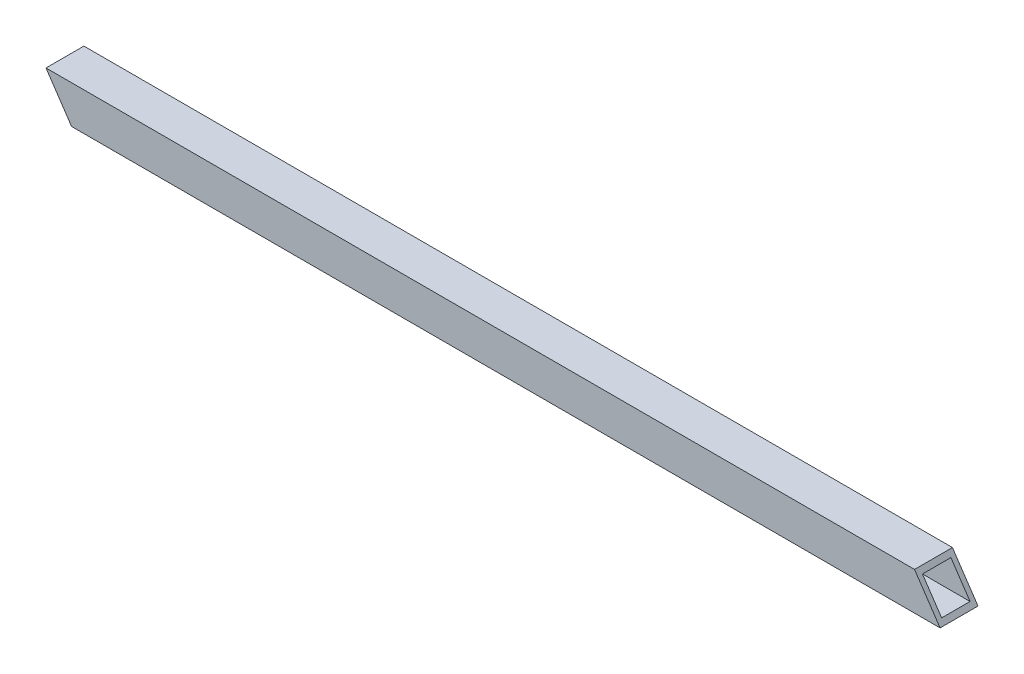
ISO-10303-21;
HEADER;
FILE_DESCRIPTION(('STEP AP214'),'2;1');
FILE_NAME('part.step','',(''),(''),'','','');
FILE_SCHEMA(('AUTOMOTIVE_DESIGN { 1 0 10303 214 1 1 1 1 }'));
ENDSEC;
DATA;
#1=APPLICATION_CONTEXT('core data for automotive mechanical design processes');
#2=APPLICATION_PROTOCOL_DEFINITION('international standard','automotive_design',2000,#1);
#3=PRODUCT_CONTEXT('',#1,'mechanical');
#4=PRODUCT('Part','Part','',(#3));
#5=PRODUCT_RELATED_PRODUCT_CATEGORY('part','',(#4));
#6=PRODUCT_DEFINITION_FORMATION('','',#4);
#7=PRODUCT_DEFINITION_CONTEXT('part definition',#1,'design');
#8=PRODUCT_DEFINITION('design','',#6,#7);
#9=PRODUCT_DEFINITION_SHAPE('','',#8);
#10=(LENGTH_UNIT() NAMED_UNIT(*) SI_UNIT(.MILLI.,.METRE.));
#11=(NAMED_UNIT(*) PLANE_ANGLE_UNIT() SI_UNIT($,.RADIAN.));
#12=(NAMED_UNIT(*) SI_UNIT($,.STERADIAN.) SOLID_ANGLE_UNIT());
#13=UNCERTAINTY_MEASURE_WITH_UNIT(LENGTH_MEASURE(1.E-05),#10,'distance_accuracy_value','');
#14=(GEOMETRIC_REPRESENTATION_CONTEXT(3) GLOBAL_UNCERTAINTY_ASSIGNED_CONTEXT((#13)) GLOBAL_UNIT_ASSIGNED_CONTEXT((#10,
#11,#12)) REPRESENTATION_CONTEXT('',''));
#15=CARTESIAN_POINT('',(0.,0.,0.));
#16=DIRECTION('',(0.,0.,1.));
#17=DIRECTION('',(1.,0.,0.));
#18=AXIS2_PLACEMENT_3D('',#15,#16,#17);
#19=CARTESIAN_POINT('',(1930.4,426.362283996303,-242.054722692657));
#20=DIRECTION('',(0.,0.,1.));
#21=DIRECTION('',(1.,0.,0.));
#22=AXIS2_PLACEMENT_3D('',#19,#20,#21);
#23=PLANE('',#22);
#24=DIRECTION('',(-1.,0.,0.));
#25=VECTOR('',#24,1.);
#26=CARTESIAN_POINT('',(1930.4,477.162283996303,-242.054722692657));
#27=LINE('',#26,#25);
#28=CARTESIAN_POINT('',(1164.24156389597,477.162283996303,-242.054722692657));
#29=VERTEX_POINT('',#28);
#30=CARTESIAN_POINT('',(0.,477.162283996303,-242.054722692657));
#31=VERTEX_POINT('',#30);
#32=EDGE_CURVE('E107',#29,#31,#27,.T.);
#33=ORIENTED_EDGE('',*,*,#32,.F.);
#34=DIRECTION('',(0.559192903470751,-0.829037572555039,0.));
#35=VECTOR('',#34,1.);
#36=CARTESIAN_POINT('',(1164.24156389597,477.162283996303,-242.054722692657));
#37=LINE('',#36,#35);
#38=CARTESIAN_POINT('',(1198.50659655157,426.362283996303,-242.054722692657));
#39=VERTEX_POINT('',#38);
#40=EDGE_CURVE('E94',#29,#39,#37,.T.);
#41=ORIENTED_EDGE('',*,*,#40,.T.);
#42=DIRECTION('',(-1.,0.,0.));
#43=VECTOR('',#42,1.);
#44=CARTESIAN_POINT('',(1930.4,426.362283996303,-242.054722692657));
#45=LINE('',#44,#43);
#46=CARTESIAN_POINT('',(34.2650326555957,426.362283996303,-242.054722692657));
#47=VERTEX_POINT('',#46);
#48=EDGE_CURVE('E121',#39,#47,#45,.T.);
#49=ORIENTED_EDGE('',*,*,#48,.T.);
#50=DIRECTION('',(-0.559192903470751,0.829037572555039,0.));
#51=VECTOR('',#50,1.);
#52=CARTESIAN_POINT('',(0.,477.162283996303,-242.054722692657));
#53=LINE('',#52,#51);
#54=EDGE_CURVE('E114',#47,#31,#53,.T.);
#55=ORIENTED_EDGE('',*,*,#54,.T.);
#56=EDGE_LOOP('',(#33,#41,#49,#55));
#57=FACE_BOUND('',#56,.T.);
#58=ADVANCED_FACE('F33',(#57),#23,.F.);
#59=CARTESIAN_POINT('',(1930.4,477.162283996303,-242.054722692657));
#60=DIRECTION('',(0.,-1.,0.));
#61=DIRECTION('',(0.,0.,-1.));
#62=AXIS2_PLACEMENT_3D('',#59,#60,#61);
#63=PLANE('',#62);
#64=DIRECTION('',(-1.,0.,0.));
#65=VECTOR('',#64,1.);
#66=CARTESIAN_POINT('',(1930.4,477.162283996303,-191.254722692657));
#67=LINE('',#66,#65);
#68=CARTESIAN_POINT('',(1164.24156389597,477.162283996303,-191.254722692657));
#69=VERTEX_POINT('',#68);
#70=CARTESIAN_POINT('',(0.,477.162283996303,-191.254722692657));
#71=VERTEX_POINT('',#70);
#72=EDGE_CURVE('E109',#69,#71,#67,.T.);
#73=ORIENTED_EDGE('',*,*,#72,.F.);
#74=DIRECTION('',(0.,0.,1.));
#75=VECTOR('',#74,1.);
#76=CARTESIAN_POINT('',(1164.24156389597,477.162283996303,-242.054722692657));
#77=LINE('',#76,#75);
#78=EDGE_CURVE('E97',#29,#69,#77,.T.);
#79=ORIENTED_EDGE('',*,*,#78,.F.);
#80=ORIENTED_EDGE('',*,*,#32,.T.);
#81=DIRECTION('',(0.,0.,1.));
#82=VECTOR('',#81,1.);
#83=CARTESIAN_POINT('',(0.,477.162283996303,-242.054722692657));
#84=LINE('',#83,#82);
#85=EDGE_CURVE('E123',#31,#71,#84,.T.);
#86=ORIENTED_EDGE('',*,*,#85,.T.);
#87=EDGE_LOOP('',(#73,#79,#80,#86));
#88=FACE_BOUND('',#87,.T.);
#89=ADVANCED_FACE('F105',(#88),#63,.F.);
#90=CARTESIAN_POINT('',(1930.4,426.362283996303,-191.254722692657));
#91=DIRECTION('',(0.,0.,1.));
#92=DIRECTION('',(1.,0.,0.));
#93=AXIS2_PLACEMENT_3D('',#90,#91,#92);
#94=PLANE('',#93);
#95=DIRECTION('',(0.559192903470751,-0.829037572555039,0.));
#96=VECTOR('',#95,1.);
#97=CARTESIAN_POINT('',(1164.24156389597,477.162283996303,-191.254722692657));
#98=LINE('',#97,#96);
#99=CARTESIAN_POINT('',(1198.50659655157,426.362283996303,-191.254722692657));
#100=VERTEX_POINT('',#99);
#101=EDGE_CURVE('E47',#69,#100,#98,.T.);
#102=ORIENTED_EDGE('',*,*,#101,.F.);
#103=ORIENTED_EDGE('',*,*,#72,.T.);
#104=DIRECTION('',(-0.559192903470751,0.829037572555039,0.));
#105=VECTOR('',#104,1.);
#106=CARTESIAN_POINT('',(0.,477.162283996303,-191.254722692657));
#107=LINE('',#106,#105);
#108=CARTESIAN_POINT('',(34.2650326555957,426.362283996303,-191.254722692657));
#109=VERTEX_POINT('',#108);
#110=EDGE_CURVE('E145',#109,#71,#107,.T.);
#111=ORIENTED_EDGE('',*,*,#110,.F.);
#112=DIRECTION('',(-1.,0.,0.));
#113=VECTOR('',#112,1.);
#114=CARTESIAN_POINT('',(1930.4,426.362283996303,-191.254722692657));
#115=LINE('',#114,#113);
#116=EDGE_CURVE('E117',#100,#109,#115,.T.);
#117=ORIENTED_EDGE('',*,*,#116,.F.);
#118=EDGE_LOOP('',(#102,#103,#111,#117));
#119=FACE_BOUND('',#118,.T.);
#120=ADVANCED_FACE('F185',(#119),#94,.T.);
#121=CARTESIAN_POINT('',(1930.4,426.362283996303,-242.054722692657));
#122=DIRECTION('',(0.,-1.,0.));
#123=DIRECTION('',(0.,0.,-1.));
#124=AXIS2_PLACEMENT_3D('',#121,#122,#123);
#125=PLANE('',#124);
#126=DIRECTION('',(0.,0.,-1.));
#127=VECTOR('',#126,1.);
#128=CARTESIAN_POINT('',(1198.50659655157,426.362283996303,-242.054722692657));
#129=LINE('',#128,#127);
#130=EDGE_CURVE('E98',#100,#39,#129,.T.);
#131=ORIENTED_EDGE('',*,*,#130,.F.);
#132=ORIENTED_EDGE('',*,*,#116,.T.);
#133=DIRECTION('',(0.,0.,1.));
#134=VECTOR('',#133,1.);
#135=CARTESIAN_POINT('',(34.2650326555957,426.362283996303,-242.054722692657));
#136=LINE('',#135,#134);
#137=EDGE_CURVE('E142',#47,#109,#136,.T.);
#138=ORIENTED_EDGE('',*,*,#137,.F.);
#139=ORIENTED_EDGE('',*,*,#48,.F.);
#140=EDGE_LOOP('',(#131,#132,#138,#139));
#141=FACE_BOUND('',#140,.T.);
#142=ADVANCED_FACE('F189',(#141),#125,.T.);
#143=CARTESIAN_POINT('',(1930.4,432.712283996303,-197.604722692657));
#144=DIRECTION('',(0.,0.,1.));
#145=DIRECTION('',(1.,0.,0.));
#146=AXIS2_PLACEMENT_3D('',#143,#144,#145);
#147=PLANE('',#146);
#148=DIRECTION('',(-1.,0.,0.));
#149=VECTOR('',#148,1.);
#150=CARTESIAN_POINT('',(1930.4,470.812283996303,-197.604722692657));
#151=LINE('',#150,#149);
#152=CARTESIAN_POINT('',(1168.52469297792,470.812283996303,-197.604722692657));
#153=VERTEX_POINT('',#152);
#154=CARTESIAN_POINT('',(4.28312908194917,470.812283996303,-197.604722692657));
#155=VERTEX_POINT('',#154);
#156=EDGE_CURVE('E126',#153,#155,#151,.T.);
#157=ORIENTED_EDGE('',*,*,#156,.F.);
#158=DIRECTION('',(0.559192903470751,-0.829037572555039,0.));
#159=VECTOR('',#158,1.);
#160=CARTESIAN_POINT('',(1424.42344223284,91.4267864597364,-197.604722692657));
#161=LINE('',#160,#159);
#162=CARTESIAN_POINT('',(1194.22346746962,432.712283996303,-197.604722692657));
#163=VERTEX_POINT('',#162);
#164=EDGE_CURVE('E55',#153,#163,#161,.T.);
#165=ORIENTED_EDGE('',*,*,#164,.T.);
#166=DIRECTION('',(-1.,0.,0.));
#167=VECTOR('',#166,1.);
#168=CARTESIAN_POINT('',(1930.4,432.712283996303,-197.604722692657));
#169=LINE('',#168,#167);
#170=CARTESIAN_POINT('',(29.9819035736462,432.712283996303,-197.604722692657));
#171=VERTEX_POINT('',#170);
#172=EDGE_CURVE('E125',#163,#171,#169,.T.);
#173=ORIENTED_EDGE('',*,*,#172,.T.);
#174=DIRECTION('',(-0.559192903470751,0.829037572555039,0.));
#175=VECTOR('',#174,1.);
#176=CARTESIAN_POINT('',(624.236377202718,-448.306203970232,-197.604722692657));
#177=LINE('',#176,#175);
#178=EDGE_CURVE('E129',#171,#155,#177,.T.);
#179=ORIENTED_EDGE('',*,*,#178,.T.);
#180=EDGE_LOOP('',(#157,#165,#173,#179));
#181=FACE_BOUND('',#180,.T.);
#182=ADVANCED_FACE('F170',(#181),#147,.F.);
#183=CARTESIAN_POINT('',(1930.4,432.712283996303,-235.704722692657));
#184=DIRECTION('',(0.,-1.,0.));
#185=DIRECTION('',(0.,0.,-1.));
#186=AXIS2_PLACEMENT_3D('',#183,#184,#185);
#187=PLANE('',#186);
#188=ORIENTED_EDGE('',*,*,#172,.F.);
#189=DIRECTION('',(0.,0.,-1.));
#190=VECTOR('',#189,1.);
#191=CARTESIAN_POINT('',(1194.22346746962,432.712283996303,-235.704722692657));
#192=LINE('',#191,#190);
#193=CARTESIAN_POINT('',(1194.22346746962,432.712283996303,-235.704722692657));
#194=VERTEX_POINT('',#193);
#195=EDGE_CURVE('E151',#163,#194,#192,.T.);
#196=ORIENTED_EDGE('',*,*,#195,.T.);
#197=DIRECTION('',(-1.,0.,0.));
#198=VECTOR('',#197,1.);
#199=CARTESIAN_POINT('',(1930.4,432.712283996303,-235.704722692657));
#200=LINE('',#199,#198);
#201=CARTESIAN_POINT('',(29.9819035736464,432.712283996303,-235.704722692657));
#202=VERTEX_POINT('',#201);
#203=EDGE_CURVE('E131',#194,#202,#200,.T.);
#204=ORIENTED_EDGE('',*,*,#203,.T.);
#205=DIRECTION('',(0.,0.,1.));
#206=VECTOR('',#205,1.);
#207=CARTESIAN_POINT('',(29.9819035736462,432.712283996303,-235.704722692657));
#208=LINE('',#207,#206);
#209=EDGE_CURVE('E136',#202,#171,#208,.T.);
#210=ORIENTED_EDGE('',*,*,#209,.T.);
#211=EDGE_LOOP('',(#188,#196,#204,#210));
#212=FACE_BOUND('',#211,.T.);
#213=ADVANCED_FACE('F173',(#212),#187,.F.);
#214=CARTESIAN_POINT('',(1930.4,432.712283996303,-235.704722692657));
#215=DIRECTION('',(0.,0.,-1.));
#216=DIRECTION('',(-1.,0.,0.));
#217=AXIS2_PLACEMENT_3D('',#214,#215,#216);
#218=PLANE('',#217);
#219=ORIENTED_EDGE('',*,*,#203,.F.);
#220=DIRECTION('',(-0.559192903470751,0.829037572555039,0.));
#221=VECTOR('',#220,1.);
#222=CARTESIAN_POINT('',(1424.42344223284,91.4267864597364,-235.704722692657));
#223=LINE('',#222,#221);
#224=CARTESIAN_POINT('',(1168.52469297792,470.812283996303,-235.704722692657));
#225=VERTEX_POINT('',#224);
#226=EDGE_CURVE('E110',#194,#225,#223,.T.);
#227=ORIENTED_EDGE('',*,*,#226,.T.);
#228=DIRECTION('',(-1.,0.,0.));
#229=VECTOR('',#228,1.);
#230=CARTESIAN_POINT('',(1930.4,470.812283996303,-235.704722692657));
#231=LINE('',#230,#229);
#232=CARTESIAN_POINT('',(4.28312908194961,470.812283996303,-235.704722692657));
#233=VERTEX_POINT('',#232);
#234=EDGE_CURVE('E128',#225,#233,#231,.T.);
#235=ORIENTED_EDGE('',*,*,#234,.T.);
#236=DIRECTION('',(0.559192903470751,-0.829037572555039,0.));
#237=VECTOR('',#236,1.);
#238=CARTESIAN_POINT('',(624.236377202718,-448.306203970232,-235.704722692657));
#239=LINE('',#238,#237);
#240=EDGE_CURVE('E139',#233,#202,#239,.T.);
#241=ORIENTED_EDGE('',*,*,#240,.T.);
#242=EDGE_LOOP('',(#219,#227,#235,#241));
#243=FACE_BOUND('',#242,.T.);
#244=ADVANCED_FACE('F159',(#243),#218,.F.);
#245=CARTESIAN_POINT('',(1930.4,470.812283996303,-235.704722692657));
#246=DIRECTION('',(0.,1.,0.));
#247=DIRECTION('',(0.,0.,1.));
#248=AXIS2_PLACEMENT_3D('',#245,#246,#247);
#249=PLANE('',#248);
#250=ORIENTED_EDGE('',*,*,#234,.F.);
#251=DIRECTION('',(0.,0.,1.));
#252=VECTOR('',#251,1.);
#253=CARTESIAN_POINT('',(1168.52469297792,470.812283996303,-235.704722692657));
#254=LINE('',#253,#252);
#255=EDGE_CURVE('E11',#225,#153,#254,.T.);
#256=ORIENTED_EDGE('',*,*,#255,.T.);
#257=ORIENTED_EDGE('',*,*,#156,.T.);
#258=DIRECTION('',(0.,0.,-1.));
#259=VECTOR('',#258,1.);
#260=CARTESIAN_POINT('',(4.28312908194917,470.812283996303,-235.704722692657));
#261=LINE('',#260,#259);
#262=EDGE_CURVE('E40',#155,#233,#261,.T.);
#263=ORIENTED_EDGE('',*,*,#262,.T.);
#264=EDGE_LOOP('',(#250,#256,#257,#263));
#265=FACE_BOUND('',#264,.T.);
#266=ADVANCED_FACE('F162',(#265),#249,.F.);
#267=CARTESIAN_POINT('',(0.,477.162283996303,-242.054722692657));
#268=DIRECTION('',(0.829037572555039,0.559192903470751,0.));
#269=DIRECTION('',(-0.559192903470751,0.829037572555039,0.));
#270=AXIS2_PLACEMENT_3D('',#267,#268,#269);
#271=PLANE('',#270);
#272=ORIENTED_EDGE('',*,*,#110,.T.);
#273=ORIENTED_EDGE('',*,*,#85,.F.);
#274=ORIENTED_EDGE('',*,*,#54,.F.);
#275=ORIENTED_EDGE('',*,*,#137,.T.);
#276=EDGE_LOOP('',(#272,#273,#274,#275));
#277=FACE_BOUND('',#276,.T.);
#278=ORIENTED_EDGE('',*,*,#209,.F.);
#279=ORIENTED_EDGE('',*,*,#240,.F.);
#280=ORIENTED_EDGE('',*,*,#262,.F.);
#281=ORIENTED_EDGE('',*,*,#178,.F.);
#282=EDGE_LOOP('',(#278,#279,#280,#281));
#283=FACE_BOUND('',#282,.T.);
#284=ADVANCED_FACE('F168',(#277,#283),#271,.F.);
#285=CARTESIAN_POINT('',(1164.24156389597,477.162283996303,-242.054722692657));
#286=DIRECTION('',(-0.829037572555039,-0.559192903470751,0.));
#287=DIRECTION('',(0.559192903470751,-0.829037572555039,0.));
#288=AXIS2_PLACEMENT_3D('',#285,#286,#287);
#289=PLANE('',#288);
#290=ORIENTED_EDGE('',*,*,#130,.T.);
#291=ORIENTED_EDGE('',*,*,#40,.F.);
#292=ORIENTED_EDGE('',*,*,#78,.T.);
#293=ORIENTED_EDGE('',*,*,#101,.T.);
#294=EDGE_LOOP('',(#290,#291,#292,#293));
#295=FACE_BOUND('',#294,.T.);
#296=ORIENTED_EDGE('',*,*,#255,.F.);
#297=ORIENTED_EDGE('',*,*,#226,.F.);
#298=ORIENTED_EDGE('',*,*,#195,.F.);
#299=ORIENTED_EDGE('',*,*,#164,.F.);
#300=EDGE_LOOP('',(#296,#297,#298,#299));
#301=FACE_BOUND('',#300,.T.);
#302=ADVANCED_FACE('F96',(#295,#301),#289,.F.);
#303=CLOSED_SHELL('',(#58,#89,#120,#142,#182,#213,#244,#266,#284,#302));
#304=MANIFOLD_SOLID_BREP('B2',#303);
#305=ADVANCED_BREP_SHAPE_REPRESENTATION('',(#18,#304),#14);
#306=SHAPE_DEFINITION_REPRESENTATION(#9,#305);
ENDSEC;
END-ISO-10303-21;
